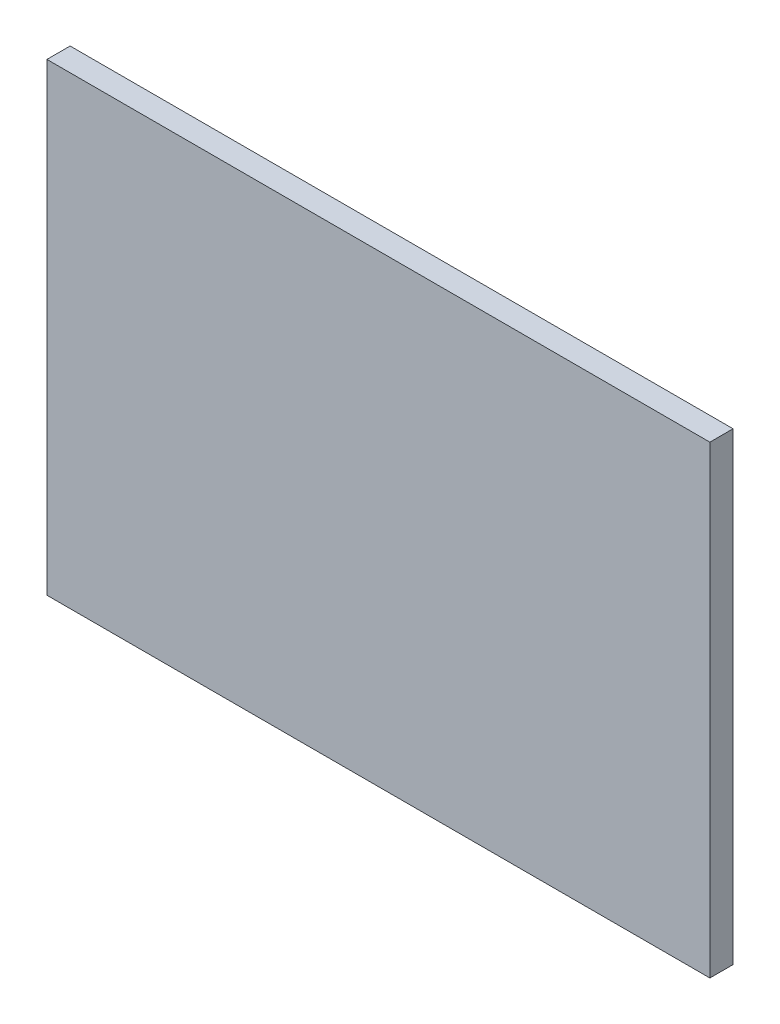
ISO-10303-21;
HEADER;
FILE_DESCRIPTION(('STEP AP214'),'2;1');
FILE_NAME('part.step','',(''),(''),'','','');
FILE_SCHEMA(('AUTOMOTIVE_DESIGN { 1 0 10303 214 1 1 1 1 }'));
ENDSEC;
DATA;
#1=APPLICATION_CONTEXT('core data for automotive mechanical design processes');
#2=APPLICATION_PROTOCOL_DEFINITION('international standard','automotive_design',2000,#1);
#3=PRODUCT_CONTEXT('',#1,'mechanical');
#4=PRODUCT('Part','Part','',(#3));
#5=PRODUCT_RELATED_PRODUCT_CATEGORY('part','',(#4));
#6=PRODUCT_DEFINITION_FORMATION('','',#4);
#7=PRODUCT_DEFINITION_CONTEXT('part definition',#1,'design');
#8=PRODUCT_DEFINITION('design','',#6,#7);
#9=PRODUCT_DEFINITION_SHAPE('','',#8);
#10=(LENGTH_UNIT() NAMED_UNIT(*) SI_UNIT(.MILLI.,.METRE.));
#11=(NAMED_UNIT(*) PLANE_ANGLE_UNIT() SI_UNIT($,.RADIAN.));
#12=(NAMED_UNIT(*) SI_UNIT($,.STERADIAN.) SOLID_ANGLE_UNIT());
#13=UNCERTAINTY_MEASURE_WITH_UNIT(LENGTH_MEASURE(1.E-05),#10,'distance_accuracy_value','');
#14=(GEOMETRIC_REPRESENTATION_CONTEXT(3) GLOBAL_UNCERTAINTY_ASSIGNED_CONTEXT((#13)) GLOBAL_UNIT_ASSIGNED_CONTEXT((#10,
#11,#12)) REPRESENTATION_CONTEXT('',''));
#15=CARTESIAN_POINT('',(0.,0.,0.));
#16=DIRECTION('',(0.,0.,1.));
#17=DIRECTION('',(1.,0.,0.));
#18=AXIS2_PLACEMENT_3D('',#15,#16,#17);
#19=CARTESIAN_POINT('',(875.5,749.2,0.));
#20=DIRECTION('',(0.,-1.,0.));
#21=DIRECTION('',(-1.,0.,0.));
#22=AXIS2_PLACEMENT_3D('',#19,#20,#21);
#23=PLANE('',#22);
#24=DIRECTION('',(-1.,0.,0.));
#25=VECTOR('',#24,1.);
#26=CARTESIAN_POINT('',(875.5,749.2,0.0350012));
#27=LINE('',#26,#25);
#28=CARTESIAN_POINT('',(875.5,749.2,0.0350012));
#29=VERTEX_POINT('',#28);
#30=CARTESIAN_POINT('',(874.5,749.2,0.0350012));
#31=VERTEX_POINT('',#30);
#32=EDGE_CURVE('E11',#29,#31,#27,.T.);
#33=ORIENTED_EDGE('',*,*,#32,.F.);
#34=DIRECTION('',(0.,0.,1.));
#35=VECTOR('',#34,1.);
#36=CARTESIAN_POINT('',(875.5,749.2,0.));
#37=LINE('',#36,#35);
#38=CARTESIAN_POINT('',(875.5,749.2,0.));
#39=VERTEX_POINT('',#38);
#40=EDGE_CURVE('E24',#39,#29,#37,.T.);
#41=ORIENTED_EDGE('',*,*,#40,.F.);
#42=DIRECTION('',(-1.,0.,0.));
#43=VECTOR('',#42,1.);
#44=CARTESIAN_POINT('',(875.5,749.2,0.));
#45=LINE('',#44,#43);
#46=CARTESIAN_POINT('',(874.5,749.2,0.));
#47=VERTEX_POINT('',#46);
#48=EDGE_CURVE('E75',#39,#47,#45,.T.);
#49=ORIENTED_EDGE('',*,*,#48,.T.);
#50=DIRECTION('',(0.,0.,1.));
#51=VECTOR('',#50,1.);
#52=CARTESIAN_POINT('',(874.5,749.2,0.));
#53=LINE('',#52,#51);
#54=EDGE_CURVE('E37',#47,#31,#53,.T.);
#55=ORIENTED_EDGE('',*,*,#54,.T.);
#56=EDGE_LOOP('',(#33,#41,#49,#55));
#57=FACE_BOUND('',#56,.T.);
#58=ADVANCED_FACE('F17',(#57),#23,.F.);
#59=CARTESIAN_POINT('',(874.5,749.2,0.));
#60=DIRECTION('',(1.,0.,0.));
#61=DIRECTION('',(0.,-1.,0.));
#62=AXIS2_PLACEMENT_3D('',#59,#60,#61);
#63=PLANE('',#62);
#64=DIRECTION('',(0.,-1.,0.));
#65=VECTOR('',#64,1.);
#66=CARTESIAN_POINT('',(874.5,749.2,0.0350012));
#67=LINE('',#66,#65);
#68=CARTESIAN_POINT('',(874.5,748.5,0.0350012));
#69=VERTEX_POINT('',#68);
#70=EDGE_CURVE('E83',#31,#69,#67,.T.);
#71=ORIENTED_EDGE('',*,*,#70,.F.);
#72=ORIENTED_EDGE('',*,*,#54,.F.);
#73=DIRECTION('',(0.,-1.,0.));
#74=VECTOR('',#73,1.);
#75=CARTESIAN_POINT('',(874.5,749.2,0.));
#76=LINE('',#75,#74);
#77=CARTESIAN_POINT('',(874.5,748.5,0.));
#78=VERTEX_POINT('',#77);
#79=EDGE_CURVE('E81',#47,#78,#76,.T.);
#80=ORIENTED_EDGE('',*,*,#79,.T.);
#81=DIRECTION('',(0.,0.,1.));
#82=VECTOR('',#81,1.);
#83=CARTESIAN_POINT('',(874.5,748.5,0.));
#84=LINE('',#83,#82);
#85=EDGE_CURVE('E67',#78,#69,#84,.T.);
#86=ORIENTED_EDGE('',*,*,#85,.T.);
#87=EDGE_LOOP('',(#71,#72,#80,#86));
#88=FACE_BOUND('',#87,.T.);
#89=ADVANCED_FACE('F89',(#88),#63,.F.);
#90=CARTESIAN_POINT('',(874.5,748.5,0.));
#91=DIRECTION('',(0.,1.,0.));
#92=DIRECTION('',(1.,0.,0.));
#93=AXIS2_PLACEMENT_3D('',#90,#91,#92);
#94=PLANE('',#93);
#95=DIRECTION('',(1.,0.,0.));
#96=VECTOR('',#95,1.);
#97=CARTESIAN_POINT('',(874.5,748.5,0.0350012));
#98=LINE('',#97,#96);
#99=CARTESIAN_POINT('',(875.5,748.5,0.0350012));
#100=VERTEX_POINT('',#99);
#101=EDGE_CURVE('E71',#69,#100,#98,.T.);
#102=ORIENTED_EDGE('',*,*,#101,.F.);
#103=ORIENTED_EDGE('',*,*,#85,.F.);
#104=DIRECTION('',(1.,0.,0.));
#105=VECTOR('',#104,1.);
#106=CARTESIAN_POINT('',(874.5,748.5,0.));
#107=LINE('',#106,#105);
#108=CARTESIAN_POINT('',(875.5,748.5,0.));
#109=VERTEX_POINT('',#108);
#110=EDGE_CURVE('E63',#78,#109,#107,.T.);
#111=ORIENTED_EDGE('',*,*,#110,.T.);
#112=DIRECTION('',(0.,0.,1.));
#113=VECTOR('',#112,1.);
#114=CARTESIAN_POINT('',(875.5,748.5,0.));
#115=LINE('',#114,#113);
#116=EDGE_CURVE('E53',#109,#100,#115,.T.);
#117=ORIENTED_EDGE('',*,*,#116,.T.);
#118=EDGE_LOOP('',(#102,#103,#111,#117));
#119=FACE_BOUND('',#118,.T.);
#120=ADVANCED_FACE('F66',(#119),#94,.F.);
#121=CARTESIAN_POINT('',(875.5,748.5,0.));
#122=DIRECTION('',(-1.,0.,0.));
#123=DIRECTION('',(0.,1.,0.));
#124=AXIS2_PLACEMENT_3D('',#121,#122,#123);
#125=PLANE('',#124);
#126=DIRECTION('',(0.,1.,0.));
#127=VECTOR('',#126,1.);
#128=CARTESIAN_POINT('',(875.5,748.5,0.0350012));
#129=LINE('',#128,#127);
#130=EDGE_CURVE('E59',#100,#29,#129,.T.);
#131=ORIENTED_EDGE('',*,*,#130,.F.);
#132=ORIENTED_EDGE('',*,*,#116,.F.);
#133=DIRECTION('',(0.,1.,0.));
#134=VECTOR('',#133,1.);
#135=CARTESIAN_POINT('',(875.5,748.5,0.));
#136=LINE('',#135,#134);
#137=EDGE_CURVE('E57',#109,#39,#136,.T.);
#138=ORIENTED_EDGE('',*,*,#137,.T.);
#139=ORIENTED_EDGE('',*,*,#40,.T.);
#140=EDGE_LOOP('',(#131,#132,#138,#139));
#141=FACE_BOUND('',#140,.T.);
#142=ADVANCED_FACE('F55',(#141),#125,.F.);
#143=CARTESIAN_POINT('',(875.,748.85,0.));
#144=DIRECTION('',(0.,0.,1.));
#145=DIRECTION('',(1.,0.,0.));
#146=AXIS2_PLACEMENT_3D('',#143,#144,#145);
#147=PLANE('',#146);
#148=ORIENTED_EDGE('',*,*,#137,.F.);
#149=ORIENTED_EDGE('',*,*,#110,.F.);
#150=ORIENTED_EDGE('',*,*,#79,.F.);
#151=ORIENTED_EDGE('',*,*,#48,.F.);
#152=EDGE_LOOP('',(#148,#149,#150,#151));
#153=FACE_BOUND('',#152,.T.);
#154=ADVANCED_FACE('F74',(#153),#147,.F.);
#155=CARTESIAN_POINT('',(875.,748.85,0.0350012));
#156=DIRECTION('',(0.,0.,1.));
#157=DIRECTION('',(1.,0.,0.));
#158=AXIS2_PLACEMENT_3D('',#155,#156,#157);
#159=PLANE('',#158);
#160=ORIENTED_EDGE('',*,*,#32,.T.);
#161=ORIENTED_EDGE('',*,*,#70,.T.);
#162=ORIENTED_EDGE('',*,*,#101,.T.);
#163=ORIENTED_EDGE('',*,*,#130,.T.);
#164=EDGE_LOOP('',(#160,#161,#162,#163));
#165=FACE_BOUND('',#164,.T.);
#166=ADVANCED_FACE('F91',(#165),#159,.T.);
#167=CLOSED_SHELL('',(#58,#89,#120,#142,#154,#166));
#168=MANIFOLD_SOLID_BREP('B1',#167);
#169=ADVANCED_BREP_SHAPE_REPRESENTATION('',(#18,#168),#14);
#170=SHAPE_DEFINITION_REPRESENTATION(#9,#169);
ENDSEC;
END-ISO-10303-21;
